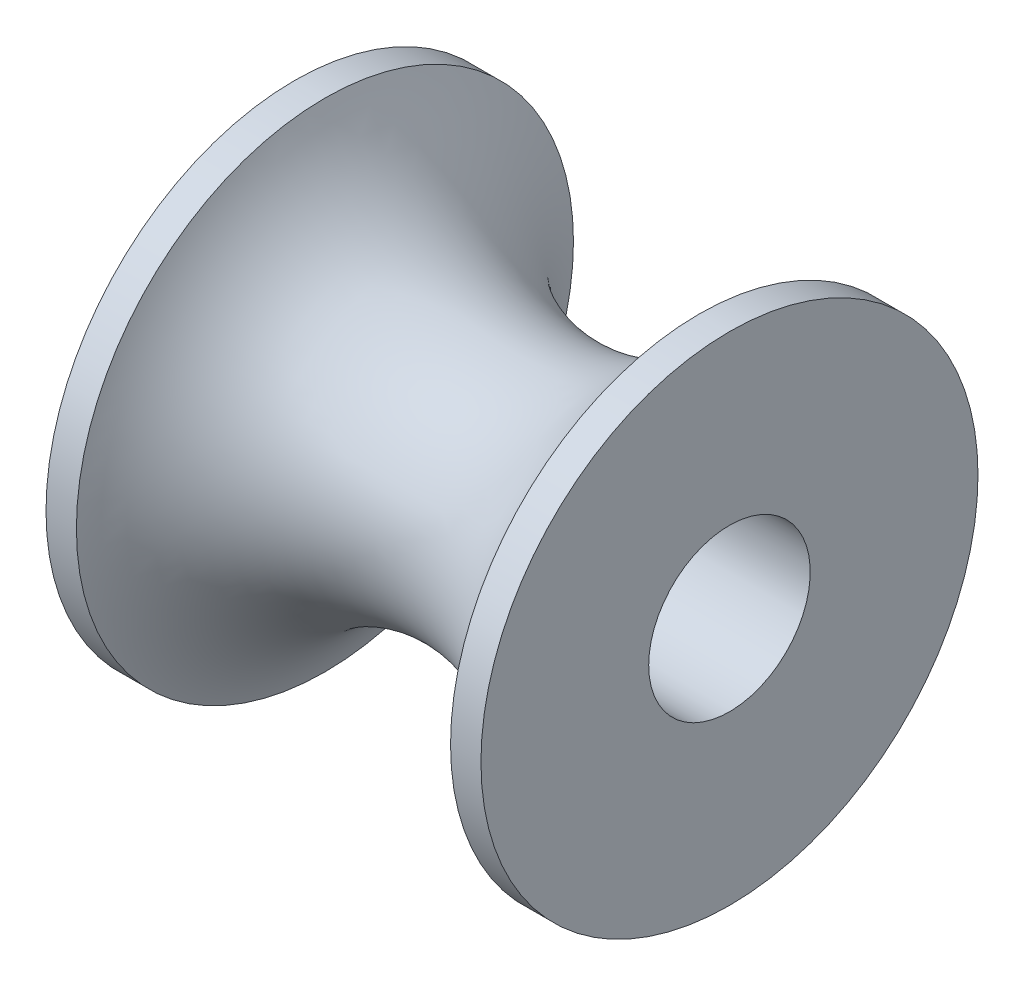
ISO-10303-21;
HEADER;
FILE_DESCRIPTION(('STEP AP214'),'2;1');
FILE_NAME('part.step','',(''),(''),'','','');
FILE_SCHEMA(('AUTOMOTIVE_DESIGN { 1 0 10303 214 1 1 1 1 }'));
ENDSEC;
DATA;
#1=APPLICATION_CONTEXT('core data for automotive mechanical design processes');
#2=APPLICATION_PROTOCOL_DEFINITION('international standard','automotive_design',2000,#1);
#3=PRODUCT_CONTEXT('',#1,'mechanical');
#4=PRODUCT('Part','Part','',(#3));
#5=PRODUCT_RELATED_PRODUCT_CATEGORY('part','',(#4));
#6=PRODUCT_DEFINITION_FORMATION('','',#4);
#7=PRODUCT_DEFINITION_CONTEXT('part definition',#1,'design');
#8=PRODUCT_DEFINITION('design','',#6,#7);
#9=PRODUCT_DEFINITION_SHAPE('','',#8);
#10=(LENGTH_UNIT() NAMED_UNIT(*) SI_UNIT(.MILLI.,.METRE.));
#11=(NAMED_UNIT(*) PLANE_ANGLE_UNIT() SI_UNIT($,.RADIAN.));
#12=(NAMED_UNIT(*) SI_UNIT($,.STERADIAN.) SOLID_ANGLE_UNIT());
#13=UNCERTAINTY_MEASURE_WITH_UNIT(LENGTH_MEASURE(1.E-05),#10,'distance_accuracy_value','');
#14=(GEOMETRIC_REPRESENTATION_CONTEXT(3) GLOBAL_UNCERTAINTY_ASSIGNED_CONTEXT((#13)) GLOBAL_UNIT_ASSIGNED_CONTEXT((#10,
#11,#12)) REPRESENTATION_CONTEXT('',''));
#15=CARTESIAN_POINT('',(0.,0.,0.));
#16=DIRECTION('',(0.,0.,1.));
#17=DIRECTION('',(1.,0.,0.));
#18=AXIS2_PLACEMENT_3D('',#15,#16,#17);
#19=CARTESIAN_POINT('',(0.,0.,0.));
#20=DIRECTION('',(1.,0.,0.));
#21=DIRECTION('',(0.,0.,-1.));
#22=AXIS2_PLACEMENT_3D('',#19,#20,#21);
#23=PLANE('',#22);
#24=CARTESIAN_POINT('',(0.,0.,0.));
#25=DIRECTION('',(-1.,0.,0.));
#26=DIRECTION('',(0.,0.,1.));
#27=AXIS2_PLACEMENT_3D('',#24,#25,#26);
#28=CIRCLE('',#27,2.6);
#29=CARTESIAN_POINT('',(0.,0.,2.6));
#30=VERTEX_POINT('',#29);
#31=EDGE_CURVE('E59',#30,#30,#28,.T.);
#32=ORIENTED_EDGE('',*,*,#31,.F.);
#33=EDGE_LOOP('',(#32));
#34=FACE_BOUND('',#33,.T.);
#35=CARTESIAN_POINT('',(0.,0.,0.));
#36=DIRECTION('',(-1.,0.,0.));
#37=DIRECTION('',(0.,0.,1.));
#38=AXIS2_PLACEMENT_3D('',#35,#36,#37);
#39=CIRCLE('',#38,8.);
#40=CARTESIAN_POINT('',(0.,0.,8.));
#41=VERTEX_POINT('',#40);
#42=EDGE_CURVE('E53',#41,#41,#39,.T.);
#43=ORIENTED_EDGE('',*,*,#42,.T.);
#44=EDGE_LOOP('',(#43));
#45=FACE_BOUND('',#44,.T.);
#46=ADVANCED_FACE('F39',(#34,#45),#23,.F.);
#47=CARTESIAN_POINT('',(14.,0.,0.));
#48=DIRECTION('',(-1.,0.,0.));
#49=DIRECTION('',(0.,0.,1.));
#50=AXIS2_PLACEMENT_3D('',#47,#48,#49);
#51=PLANE('',#50);
#52=CARTESIAN_POINT('',(14.,0.,0.));
#53=DIRECTION('',(-1.,0.,0.));
#54=DIRECTION('',(0.,0.,1.));
#55=AXIS2_PLACEMENT_3D('',#52,#53,#54);
#56=CIRCLE('',#55,2.6);
#57=CARTESIAN_POINT('',(14.,0.,2.6));
#58=VERTEX_POINT('',#57);
#59=EDGE_CURVE('E58',#58,#58,#56,.T.);
#60=ORIENTED_EDGE('',*,*,#59,.T.);
#61=EDGE_LOOP('',(#60));
#62=FACE_BOUND('',#61,.T.);
#63=CARTESIAN_POINT('',(14.,0.,0.));
#64=DIRECTION('',(-1.,0.,0.));
#65=DIRECTION('',(0.,0.,1.));
#66=AXIS2_PLACEMENT_3D('',#63,#64,#65);
#67=CIRCLE('',#66,8.);
#68=CARTESIAN_POINT('',(14.,0.,8.));
#69=VERTEX_POINT('',#68);
#70=EDGE_CURVE('E10',#69,#69,#67,.T.);
#71=ORIENTED_EDGE('',*,*,#70,.F.);
#72=EDGE_LOOP('',(#71));
#73=FACE_BOUND('',#72,.T.);
#74=ADVANCED_FACE('F65',(#62,#73),#51,.F.);
#75=CARTESIAN_POINT('',(0.,0.,0.));
#76=DIRECTION('',(-1.,0.,0.));
#77=DIRECTION('',(0.,0.,1.));
#78=AXIS2_PLACEMENT_3D('',#75,#76,#77);
#79=CYLINDRICAL_SURFACE('',#78,8.);
#80=CARTESIAN_POINT('',(13.0214330518296,0.,0.));
#81=DIRECTION('',(-1.,0.,0.));
#82=DIRECTION('',(0.,0.,1.));
#83=AXIS2_PLACEMENT_3D('',#80,#81,#82);
#84=CIRCLE('',#83,8.);
#85=CARTESIAN_POINT('',(13.0214330518296,0.,8.));
#86=VERTEX_POINT('',#85);
#87=EDGE_CURVE('E45',#86,#86,#84,.T.);
#88=ORIENTED_EDGE('',*,*,#87,.F.);
#89=EDGE_LOOP('',(#88));
#90=FACE_BOUND('',#89,.T.);
#91=ORIENTED_EDGE('',*,*,#70,.T.);
#92=EDGE_LOOP('',(#91));
#93=FACE_BOUND('',#92,.T.);
#94=ADVANCED_FACE('F86',(#90,#93),#79,.T.);
#95=CARTESIAN_POINT('',(7.,0.,0.));
#96=DIRECTION('',(-1.,0.,0.));
#97=DIRECTION('',(0.,0.,1.));
#98=AXIS2_PLACEMENT_3D('',#95,#96,#97);
#99=TOROIDAL_SURFACE('',#98,10.4479264699608,6.5);
#100=CARTESIAN_POINT('',(0.978566948170445,0.,0.));
#101=DIRECTION('',(-1.,0.,0.));
#102=DIRECTION('',(0.,0.,1.));
#103=AXIS2_PLACEMENT_3D('',#100,#101,#102);
#104=CIRCLE('',#103,8.);
#105=CARTESIAN_POINT('',(0.978566948170445,0.,8.));
#106=VERTEX_POINT('',#105);
#107=EDGE_CURVE('E49',#106,#106,#104,.T.);
#108=ORIENTED_EDGE('',*,*,#107,.F.);
#109=EDGE_LOOP('',(#108));
#110=FACE_BOUND('',#109,.T.);
#111=ORIENTED_EDGE('',*,*,#87,.T.);
#112=EDGE_LOOP('',(#111));
#113=FACE_BOUND('',#112,.T.);
#114=ADVANCED_FACE('F81',(#110,#113),#99,.F.);
#115=CARTESIAN_POINT('',(0.,0.,0.));
#116=DIRECTION('',(-1.,0.,0.));
#117=DIRECTION('',(0.,0.,1.));
#118=AXIS2_PLACEMENT_3D('',#115,#116,#117);
#119=CYLINDRICAL_SURFACE('',#118,8.);
#120=ORIENTED_EDGE('',*,*,#42,.F.);
#121=EDGE_LOOP('',(#120));
#122=FACE_BOUND('',#121,.T.);
#123=ORIENTED_EDGE('',*,*,#107,.T.);
#124=EDGE_LOOP('',(#123));
#125=FACE_BOUND('',#124,.T.);
#126=ADVANCED_FACE('F71',(#122,#125),#119,.T.);
#127=CARTESIAN_POINT('',(14.,0.,0.));
#128=DIRECTION('',(-1.,0.,0.));
#129=DIRECTION('',(0.,0.,1.));
#130=AXIS2_PLACEMENT_3D('',#127,#128,#129);
#131=CYLINDRICAL_SURFACE('',#130,2.6);
#132=ORIENTED_EDGE('',*,*,#59,.F.);
#133=EDGE_LOOP('',(#132));
#134=FACE_BOUND('',#133,.T.);
#135=ORIENTED_EDGE('',*,*,#31,.T.);
#136=EDGE_LOOP('',(#135));
#137=FACE_BOUND('',#136,.T.);
#138=ADVANCED_FACE('F68',(#134,#137),#131,.F.);
#139=CLOSED_SHELL('',(#46,#74,#94,#114,#126,#138));
#140=MANIFOLD_SOLID_BREP('B2',#139);
#141=ADVANCED_BREP_SHAPE_REPRESENTATION('',(#18,#140),#14);
#142=SHAPE_DEFINITION_REPRESENTATION(#9,#141);
ENDSEC;
END-ISO-10303-21;
